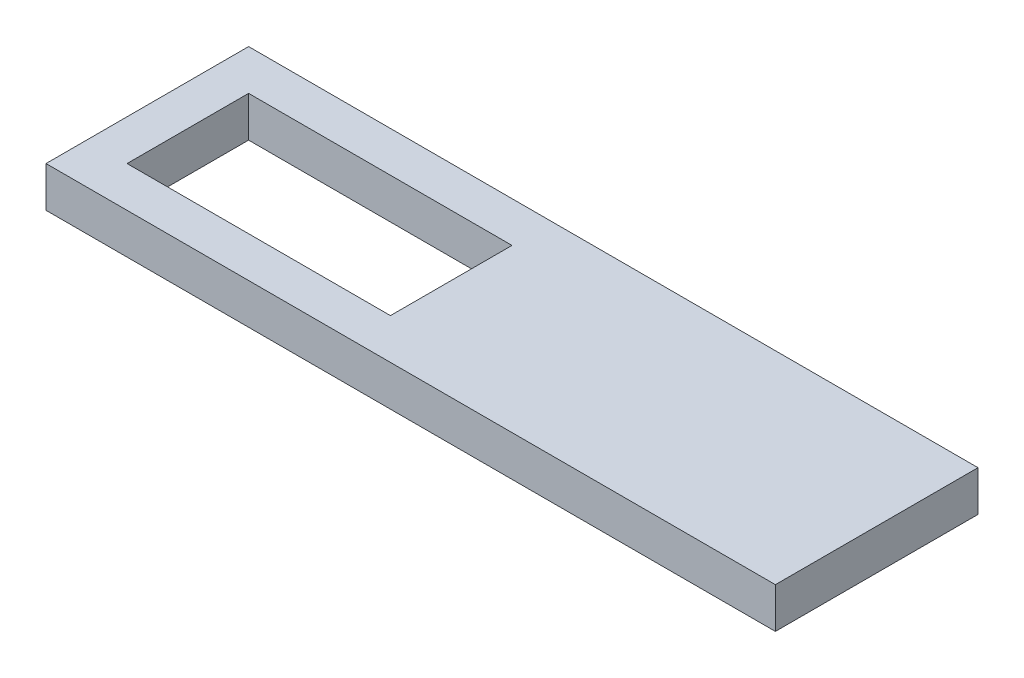
ISO-10303-21;
HEADER;
FILE_DESCRIPTION(('STEP AP214'),'2;1');
FILE_NAME('part.step','',(''),(''),'','','');
FILE_SCHEMA(('AUTOMOTIVE_DESIGN { 1 0 10303 214 1 1 1 1 }'));
ENDSEC;
DATA;
#1=APPLICATION_CONTEXT('core data for automotive mechanical design processes');
#2=APPLICATION_PROTOCOL_DEFINITION('international standard','automotive_design',2000,#1);
#3=PRODUCT_CONTEXT('',#1,'mechanical');
#4=PRODUCT('Part','Part','',(#3));
#5=PRODUCT_RELATED_PRODUCT_CATEGORY('part','',(#4));
#6=PRODUCT_DEFINITION_FORMATION('','',#4);
#7=PRODUCT_DEFINITION_CONTEXT('part definition',#1,'design');
#8=PRODUCT_DEFINITION('design','',#6,#7);
#9=PRODUCT_DEFINITION_SHAPE('','',#8);
#10=(LENGTH_UNIT() NAMED_UNIT(*) SI_UNIT(.MILLI.,.METRE.));
#11=(NAMED_UNIT(*) PLANE_ANGLE_UNIT() SI_UNIT($,.RADIAN.));
#12=(NAMED_UNIT(*) SI_UNIT($,.STERADIAN.) SOLID_ANGLE_UNIT());
#13=UNCERTAINTY_MEASURE_WITH_UNIT(LENGTH_MEASURE(1.E-05),#10,'distance_accuracy_value','');
#14=(GEOMETRIC_REPRESENTATION_CONTEXT(3) GLOBAL_UNCERTAINTY_ASSIGNED_CONTEXT((#13)) GLOBAL_UNIT_ASSIGNED_CONTEXT((#10,
#11,#12)) REPRESENTATION_CONTEXT('',''));
#15=CARTESIAN_POINT('',(0.,0.,0.));
#16=DIRECTION('',(0.,0.,1.));
#17=DIRECTION('',(1.,0.,0.));
#18=AXIS2_PLACEMENT_3D('',#15,#16,#17);
#19=CARTESIAN_POINT('',(38.1,-152.4,31.75));
#20=DIRECTION('',(-1.,0.,0.));
#21=DIRECTION('',(0.,0.,1.));
#22=AXIS2_PLACEMENT_3D('',#19,#20,#21);
#23=PLANE('',#22);
#24=DIRECTION('',(0.,1.,0.));
#25=VECTOR('',#24,1.);
#26=CARTESIAN_POINT('',(38.1,-152.4,0.));
#27=LINE('',#26,#25);
#28=CARTESIAN_POINT('',(38.1,-158.75,0.));
#29=VERTEX_POINT('',#28);
#30=CARTESIAN_POINT('',(38.1,-152.4,0.));
#31=VERTEX_POINT('',#30);
#32=EDGE_CURVE('E130',#29,#31,#27,.T.);
#33=ORIENTED_EDGE('',*,*,#32,.T.);
#34=DIRECTION('',(0.,0.,-1.));
#35=VECTOR('',#34,1.);
#36=CARTESIAN_POINT('',(38.1,-152.4,31.75));
#37=LINE('',#36,#35);
#38=CARTESIAN_POINT('',(38.1,-152.4,31.75));
#39=VERTEX_POINT('',#38);
#40=EDGE_CURVE('E11',#39,#31,#37,.T.);
#41=ORIENTED_EDGE('',*,*,#40,.F.);
#42=DIRECTION('',(0.,1.,0.));
#43=VECTOR('',#42,1.);
#44=CARTESIAN_POINT('',(38.1,-152.4,31.75));
#45=LINE('',#44,#43);
#46=CARTESIAN_POINT('',(38.1,-158.75,31.75));
#47=VERTEX_POINT('',#46);
#48=EDGE_CURVE('E134',#47,#39,#45,.T.);
#49=ORIENTED_EDGE('',*,*,#48,.F.);
#50=DIRECTION('',(0.,0.,-1.));
#51=VECTOR('',#50,1.);
#52=CARTESIAN_POINT('',(38.1,-158.75,31.75));
#53=LINE('',#52,#51);
#54=EDGE_CURVE('E144',#47,#29,#53,.T.);
#55=ORIENTED_EDGE('',*,*,#54,.T.);
#56=EDGE_LOOP('',(#33,#41,#49,#55));
#57=FACE_BOUND('',#56,.T.);
#58=ADVANCED_FACE('F33',(#57),#23,.F.);
#59=CARTESIAN_POINT('',(38.1,-152.4,31.75));
#60=DIRECTION('',(0.,-1.,0.));
#61=DIRECTION('',(1.,0.,0.));
#62=AXIS2_PLACEMENT_3D('',#59,#60,#61);
#63=PLANE('',#62);
#64=DIRECTION('',(1.,0.,0.));
#65=VECTOR('',#64,1.);
#66=CARTESIAN_POINT('',(-28.575,-152.4,6.35));
#67=LINE('',#66,#65);
#68=CARTESIAN_POINT('',(-69.85,-152.4,6.35));
#69=VERTEX_POINT('',#68);
#70=CARTESIAN_POINT('',(-28.575,-152.4,6.35));
#71=VERTEX_POINT('',#70);
#72=EDGE_CURVE('E105',#69,#71,#67,.T.);
#73=ORIENTED_EDGE('',*,*,#72,.T.);
#74=DIRECTION('',(0.,0.,1.));
#75=VECTOR('',#74,1.);
#76=CARTESIAN_POINT('',(-28.575,-152.4,6.35));
#77=LINE('',#76,#75);
#78=CARTESIAN_POINT('',(-28.575,-152.4,25.4));
#79=VERTEX_POINT('',#78);
#80=EDGE_CURVE('E99',#71,#79,#77,.T.);
#81=ORIENTED_EDGE('',*,*,#80,.T.);
#82=DIRECTION('',(-1.,0.,0.));
#83=VECTOR('',#82,1.);
#84=CARTESIAN_POINT('',(-28.575,-152.4,25.4));
#85=LINE('',#84,#83);
#86=CARTESIAN_POINT('',(-69.85,-152.4,25.4));
#87=VERTEX_POINT('',#86);
#88=EDGE_CURVE('E108',#79,#87,#85,.T.);
#89=ORIENTED_EDGE('',*,*,#88,.T.);
#90=DIRECTION('',(0.,0.,-1.));
#91=VECTOR('',#90,1.);
#92=CARTESIAN_POINT('',(-69.85,-152.4,6.35));
#93=LINE('',#92,#91);
#94=EDGE_CURVE('E47',#87,#69,#93,.T.);
#95=ORIENTED_EDGE('',*,*,#94,.T.);
#96=EDGE_LOOP('',(#73,#81,#89,#95));
#97=FACE_BOUND('',#96,.T.);
#98=DIRECTION('',(-1.,0.,0.));
#99=VECTOR('',#98,1.);
#100=CARTESIAN_POINT('',(38.1,-152.4,0.));
#101=LINE('',#100,#99);
#102=CARTESIAN_POINT('',(-76.2,-152.4,0.));
#103=VERTEX_POINT('',#102);
#104=EDGE_CURVE('E147',#31,#103,#101,.T.);
#105=ORIENTED_EDGE('',*,*,#104,.T.);
#106=DIRECTION('',(0.,0.,-1.));
#107=VECTOR('',#106,1.);
#108=CARTESIAN_POINT('',(-76.2,-152.4,31.75));
#109=LINE('',#108,#107);
#110=CARTESIAN_POINT('',(-76.2,-152.4,31.75));
#111=VERTEX_POINT('',#110);
#112=EDGE_CURVE('E40',#111,#103,#109,.T.);
#113=ORIENTED_EDGE('',*,*,#112,.F.);
#114=DIRECTION('',(-1.,0.,0.));
#115=VECTOR('',#114,1.);
#116=CARTESIAN_POINT('',(38.1,-152.4,31.75));
#117=LINE('',#116,#115);
#118=EDGE_CURVE('E137',#39,#111,#117,.T.);
#119=ORIENTED_EDGE('',*,*,#118,.F.);
#120=ORIENTED_EDGE('',*,*,#40,.T.);
#121=EDGE_LOOP('',(#105,#113,#119,#120));
#122=FACE_BOUND('',#121,.T.);
#123=ADVANCED_FACE('F112',(#97,#122),#63,.F.);
#124=CARTESIAN_POINT('',(-76.2,-152.4,31.75));
#125=DIRECTION('',(1.,0.,0.));
#126=DIRECTION('',(0.,0.,-1.));
#127=AXIS2_PLACEMENT_3D('',#124,#125,#126);
#128=PLANE('',#127);
#129=DIRECTION('',(0.,-1.,0.));
#130=VECTOR('',#129,1.);
#131=CARTESIAN_POINT('',(-76.2,-152.4,0.));
#132=LINE('',#131,#130);
#133=CARTESIAN_POINT('',(-76.2,-158.75,0.));
#134=VERTEX_POINT('',#133);
#135=EDGE_CURVE('E149',#103,#134,#132,.T.);
#136=ORIENTED_EDGE('',*,*,#135,.T.);
#137=DIRECTION('',(0.,0.,-1.));
#138=VECTOR('',#137,1.);
#139=CARTESIAN_POINT('',(-76.2,-158.75,31.75));
#140=LINE('',#139,#138);
#141=CARTESIAN_POINT('',(-76.2,-158.75,31.75));
#142=VERTEX_POINT('',#141);
#143=EDGE_CURVE('E154',#142,#134,#140,.T.);
#144=ORIENTED_EDGE('',*,*,#143,.F.);
#145=DIRECTION('',(0.,-1.,0.));
#146=VECTOR('',#145,1.);
#147=CARTESIAN_POINT('',(-76.2,-152.4,31.75));
#148=LINE('',#147,#146);
#149=EDGE_CURVE('E140',#111,#142,#148,.T.);
#150=ORIENTED_EDGE('',*,*,#149,.F.);
#151=ORIENTED_EDGE('',*,*,#112,.T.);
#152=EDGE_LOOP('',(#136,#144,#150,#151));
#153=FACE_BOUND('',#152,.T.);
#154=ADVANCED_FACE('F161',(#153),#128,.F.);
#155=CARTESIAN_POINT('',(38.1,-158.75,31.75));
#156=DIRECTION('',(0.,1.,0.));
#157=DIRECTION('',(-1.,0.,0.));
#158=AXIS2_PLACEMENT_3D('',#155,#156,#157);
#159=PLANE('',#158);
#160=DIRECTION('',(-1.,0.,0.));
#161=VECTOR('',#160,1.);
#162=CARTESIAN_POINT('',(-28.575,-158.75,25.4));
#163=LINE('',#162,#161);
#164=CARTESIAN_POINT('',(-28.575,-158.75,25.4));
#165=VERTEX_POINT('',#164);
#166=CARTESIAN_POINT('',(-69.85,-158.75,25.4));
#167=VERTEX_POINT('',#166);
#168=EDGE_CURVE('E124',#165,#167,#163,.T.);
#169=ORIENTED_EDGE('',*,*,#168,.F.);
#170=DIRECTION('',(0.,0.,1.));
#171=VECTOR('',#170,1.);
#172=CARTESIAN_POINT('',(-28.575,-158.75,6.35));
#173=LINE('',#172,#171);
#174=CARTESIAN_POINT('',(-28.575,-158.75,6.35));
#175=VERTEX_POINT('',#174);
#176=EDGE_CURVE('E55',#175,#165,#173,.T.);
#177=ORIENTED_EDGE('',*,*,#176,.F.);
#178=DIRECTION('',(1.,0.,0.));
#179=VECTOR('',#178,1.);
#180=CARTESIAN_POINT('',(-28.575,-158.75,6.35));
#181=LINE('',#180,#179);
#182=CARTESIAN_POINT('',(-69.85,-158.75,6.35));
#183=VERTEX_POINT('',#182);
#184=EDGE_CURVE('E115',#183,#175,#181,.T.);
#185=ORIENTED_EDGE('',*,*,#184,.F.);
#186=DIRECTION('',(0.,0.,-1.));
#187=VECTOR('',#186,1.);
#188=CARTESIAN_POINT('',(-69.85,-158.75,6.35));
#189=LINE('',#188,#187);
#190=EDGE_CURVE('E118',#167,#183,#189,.T.);
#191=ORIENTED_EDGE('',*,*,#190,.F.);
#192=EDGE_LOOP('',(#169,#177,#185,#191));
#193=FACE_BOUND('',#192,.T.);
#194=DIRECTION('',(1.,0.,0.));
#195=VECTOR('',#194,1.);
#196=CARTESIAN_POINT('',(38.1,-158.75,0.));
#197=LINE('',#196,#195);
#198=EDGE_CURVE('E138',#134,#29,#197,.T.);
#199=ORIENTED_EDGE('',*,*,#198,.T.);
#200=ORIENTED_EDGE('',*,*,#54,.F.);
#201=DIRECTION('',(1.,0.,0.));
#202=VECTOR('',#201,1.);
#203=CARTESIAN_POINT('',(38.1,-158.75,31.75));
#204=LINE('',#203,#202);
#205=EDGE_CURVE('E142',#142,#47,#204,.T.);
#206=ORIENTED_EDGE('',*,*,#205,.F.);
#207=ORIENTED_EDGE('',*,*,#143,.T.);
#208=EDGE_LOOP('',(#199,#200,#206,#207));
#209=FACE_BOUND('',#208,.T.);
#210=ADVANCED_FACE('F169',(#193,#209),#159,.F.);
#211=CARTESIAN_POINT('',(0.,0.,31.75));
#212=DIRECTION('',(0.,0.,-1.));
#213=DIRECTION('',(-1.,0.,0.));
#214=AXIS2_PLACEMENT_3D('',#211,#212,#213);
#215=PLANE('',#214);
#216=ORIENTED_EDGE('',*,*,#48,.T.);
#217=ORIENTED_EDGE('',*,*,#118,.T.);
#218=ORIENTED_EDGE('',*,*,#149,.T.);
#219=ORIENTED_EDGE('',*,*,#205,.T.);
#220=EDGE_LOOP('',(#216,#217,#218,#219));
#221=FACE_BOUND('',#220,.T.);
#222=ADVANCED_FACE('F175',(#221),#215,.F.);
#223=CARTESIAN_POINT('',(0.,0.,0.));
#224=DIRECTION('',(0.,0.,-1.));
#225=DIRECTION('',(-1.,0.,0.));
#226=AXIS2_PLACEMENT_3D('',#223,#224,#225);
#227=PLANE('',#226);
#228=ORIENTED_EDGE('',*,*,#32,.F.);
#229=ORIENTED_EDGE('',*,*,#198,.F.);
#230=ORIENTED_EDGE('',*,*,#135,.F.);
#231=ORIENTED_EDGE('',*,*,#104,.F.);
#232=EDGE_LOOP('',(#228,#229,#230,#231));
#233=FACE_BOUND('',#232,.T.);
#234=ADVANCED_FACE('F166',(#233),#227,.T.);
#235=CARTESIAN_POINT('',(-28.575,-152.4,6.35));
#236=DIRECTION('',(1.,0.,0.));
#237=DIRECTION('',(0.,1.,0.));
#238=AXIS2_PLACEMENT_3D('',#235,#236,#237);
#239=PLANE('',#238);
#240=ORIENTED_EDGE('',*,*,#176,.T.);
#241=DIRECTION('',(0.,-1.,0.));
#242=VECTOR('',#241,1.);
#243=CARTESIAN_POINT('',(-28.575,-152.4,25.4));
#244=LINE('',#243,#242);
#245=EDGE_CURVE('E95',#79,#165,#244,.T.);
#246=ORIENTED_EDGE('',*,*,#245,.F.);
#247=ORIENTED_EDGE('',*,*,#80,.F.);
#248=DIRECTION('',(0.,-1.,0.));
#249=VECTOR('',#248,1.);
#250=CARTESIAN_POINT('',(-28.575,-152.4,6.35));
#251=LINE('',#250,#249);
#252=EDGE_CURVE('E128',#71,#175,#251,.T.);
#253=ORIENTED_EDGE('',*,*,#252,.T.);
#254=EDGE_LOOP('',(#240,#246,#247,#253));
#255=FACE_BOUND('',#254,.T.);
#256=ADVANCED_FACE('F97',(#255),#239,.F.);
#257=CARTESIAN_POINT('',(-28.575,-152.4,6.35));
#258=DIRECTION('',(0.,0.,-1.));
#259=DIRECTION('',(-1.,0.,0.));
#260=AXIS2_PLACEMENT_3D('',#257,#258,#259);
#261=PLANE('',#260);
#262=ORIENTED_EDGE('',*,*,#184,.T.);
#263=ORIENTED_EDGE('',*,*,#252,.F.);
#264=ORIENTED_EDGE('',*,*,#72,.F.);
#265=DIRECTION('',(0.,-1.,0.));
#266=VECTOR('',#265,1.);
#267=CARTESIAN_POINT('',(-69.85,-152.4,6.35));
#268=LINE('',#267,#266);
#269=EDGE_CURVE('E131',#69,#183,#268,.T.);
#270=ORIENTED_EDGE('',*,*,#269,.T.);
#271=EDGE_LOOP('',(#262,#263,#264,#270));
#272=FACE_BOUND('',#271,.T.);
#273=ADVANCED_FACE('F192',(#272),#261,.F.);
#274=CARTESIAN_POINT('',(-69.85,-152.4,6.35));
#275=DIRECTION('',(-1.,0.,0.));
#276=DIRECTION('',(0.,-1.,0.));
#277=AXIS2_PLACEMENT_3D('',#274,#275,#276);
#278=PLANE('',#277);
#279=ORIENTED_EDGE('',*,*,#190,.T.);
#280=ORIENTED_EDGE('',*,*,#269,.F.);
#281=ORIENTED_EDGE('',*,*,#94,.F.);
#282=DIRECTION('',(0.,-1.,0.));
#283=VECTOR('',#282,1.);
#284=CARTESIAN_POINT('',(-69.85,-152.4,25.4));
#285=LINE('',#284,#283);
#286=EDGE_CURVE('E104',#87,#167,#285,.T.);
#287=ORIENTED_EDGE('',*,*,#286,.T.);
#288=EDGE_LOOP('',(#279,#280,#281,#287));
#289=FACE_BOUND('',#288,.T.);
#290=ADVANCED_FACE('F195',(#289),#278,.F.);
#291=CARTESIAN_POINT('',(-28.575,-152.4,25.4));
#292=DIRECTION('',(0.,0.,1.));
#293=DIRECTION('',(1.,0.,0.));
#294=AXIS2_PLACEMENT_3D('',#291,#292,#293);
#295=PLANE('',#294);
#296=ORIENTED_EDGE('',*,*,#168,.T.);
#297=ORIENTED_EDGE('',*,*,#286,.F.);
#298=ORIENTED_EDGE('',*,*,#88,.F.);
#299=ORIENTED_EDGE('',*,*,#245,.T.);
#300=EDGE_LOOP('',(#296,#297,#298,#299));
#301=FACE_BOUND('',#300,.T.);
#302=ADVANCED_FACE('F109',(#301),#295,.F.);
#303=CLOSED_SHELL('',(#58,#123,#154,#210,#222,#234,#256,#273,#290,#302));
#304=MANIFOLD_SOLID_BREP('B2',#303);
#305=ADVANCED_BREP_SHAPE_REPRESENTATION('',(#18,#304),#14);
#306=SHAPE_DEFINITION_REPRESENTATION(#9,#305);
ENDSEC;
END-ISO-10303-21;
